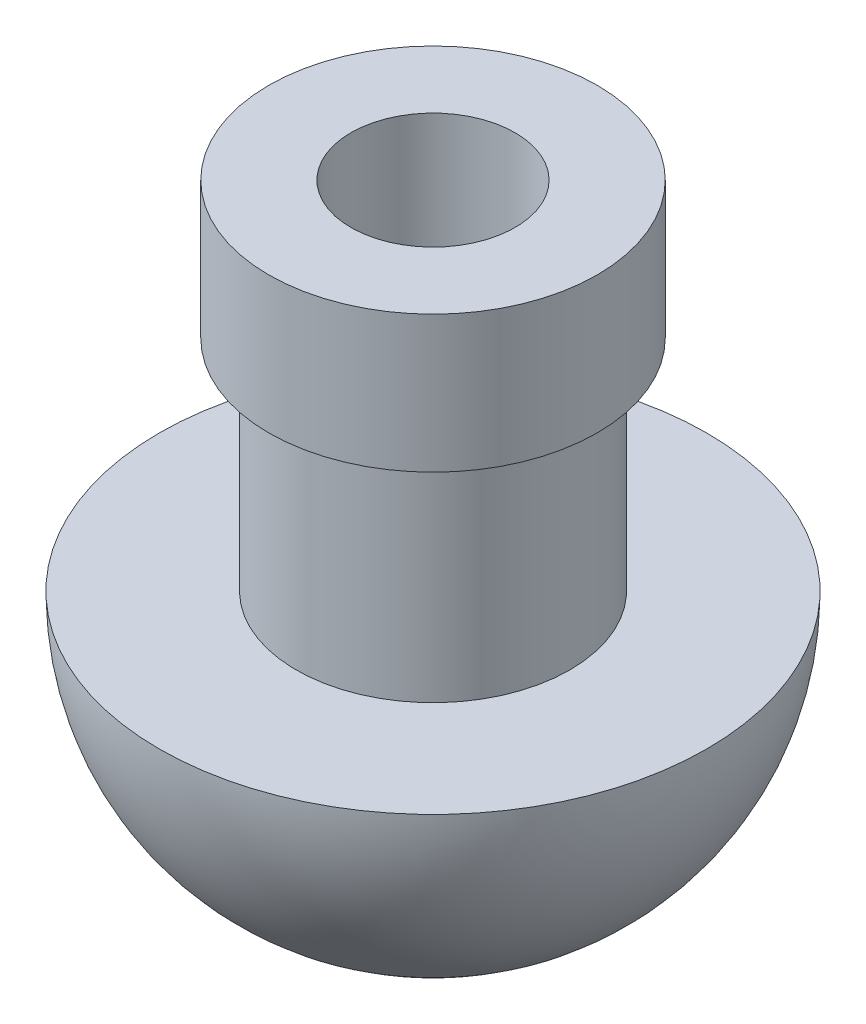
ISO-10303-21;
HEADER;
FILE_DESCRIPTION(('STEP AP214'),'2;1');
FILE_NAME('part.step','',(''),(''),'','','');
FILE_SCHEMA(('AUTOMOTIVE_DESIGN { 1 0 10303 214 1 1 1 1 }'));
ENDSEC;
DATA;
#1=APPLICATION_CONTEXT('core data for automotive mechanical design processes');
#2=APPLICATION_PROTOCOL_DEFINITION('international standard','automotive_design',2000,#1);
#3=PRODUCT_CONTEXT('',#1,'mechanical');
#4=PRODUCT('Part','Part','',(#3));
#5=PRODUCT_RELATED_PRODUCT_CATEGORY('part','',(#4));
#6=PRODUCT_DEFINITION_FORMATION('','',#4);
#7=PRODUCT_DEFINITION_CONTEXT('part definition',#1,'design');
#8=PRODUCT_DEFINITION('design','',#6,#7);
#9=PRODUCT_DEFINITION_SHAPE('','',#8);
#10=(LENGTH_UNIT() NAMED_UNIT(*) SI_UNIT(.MILLI.,.METRE.));
#11=(NAMED_UNIT(*) PLANE_ANGLE_UNIT() SI_UNIT($,.RADIAN.));
#12=(NAMED_UNIT(*) SI_UNIT($,.STERADIAN.) SOLID_ANGLE_UNIT());
#13=UNCERTAINTY_MEASURE_WITH_UNIT(LENGTH_MEASURE(1.E-05),#10,'distance_accuracy_value','');
#14=(GEOMETRIC_REPRESENTATION_CONTEXT(3) GLOBAL_UNCERTAINTY_ASSIGNED_CONTEXT((#13)) GLOBAL_UNIT_ASSIGNED_CONTEXT((#10,
#11,#12)) REPRESENTATION_CONTEXT('',''));
#15=CARTESIAN_POINT('',(0.,0.,0.));
#16=DIRECTION('',(0.,0.,1.));
#17=DIRECTION('',(1.,0.,0.));
#18=AXIS2_PLACEMENT_3D('',#15,#16,#17);
#19=CARTESIAN_POINT('',(-6.,13.,0.));
#20=DIRECTION('',(0.,-1.,0.));
#21=DIRECTION('',(1.,0.,0.));
#22=AXIS2_PLACEMENT_3D('',#19,#20,#21);
#23=PLANE('',#22);
#24=CARTESIAN_POINT('',(0.,13.,0.));
#25=DIRECTION('',(0.,1.,0.));
#26=DIRECTION('',(-1.,0.,0.));
#27=AXIS2_PLACEMENT_3D('',#24,#25,#26);
#28=CIRCLE('',#27,3.);
#29=CARTESIAN_POINT('',(-3.,13.,0.));
#30=VERTEX_POINT('',#29);
#31=EDGE_CURVE('E75',#30,#30,#28,.T.);
#32=ORIENTED_EDGE('',*,*,#31,.F.);
#33=EDGE_LOOP('',(#32));
#34=FACE_BOUND('',#33,.T.);
#35=CARTESIAN_POINT('',(0.,13.,0.));
#36=DIRECTION('',(0.,-1.,0.));
#37=DIRECTION('',(1.,0.,0.));
#38=AXIS2_PLACEMENT_3D('',#35,#36,#37);
#39=CIRCLE('',#38,6.);
#40=CARTESIAN_POINT('',(6.00000000000001,13.,0.));
#41=VERTEX_POINT('',#40);
#42=EDGE_CURVE('E10',#41,#41,#39,.T.);
#43=ORIENTED_EDGE('',*,*,#42,.F.);
#44=EDGE_LOOP('',(#43));
#45=FACE_BOUND('',#44,.T.);
#46=ADVANCED_FACE('F49',(#34,#45),#23,.F.);
#47=CARTESIAN_POINT('',(0.,-10.,0.));
#48=DIRECTION('',(0.,-1.,0.));
#49=DIRECTION('',(1.,0.,0.));
#50=AXIS2_PLACEMENT_3D('',#47,#48,#49);
#51=CYLINDRICAL_SURFACE('',#50,6.);
#52=CARTESIAN_POINT('',(0.,8.,0.));
#53=DIRECTION('',(0.,-1.,0.));
#54=DIRECTION('',(1.,0.,0.));
#55=AXIS2_PLACEMENT_3D('',#52,#53,#54);
#56=CIRCLE('',#55,6.);
#57=CARTESIAN_POINT('',(6.,8.,0.));
#58=VERTEX_POINT('',#57);
#59=EDGE_CURVE('E55',#58,#58,#56,.T.);
#60=ORIENTED_EDGE('',*,*,#59,.F.);
#61=EDGE_LOOP('',(#60));
#62=FACE_BOUND('',#61,.T.);
#63=ORIENTED_EDGE('',*,*,#42,.T.);
#64=EDGE_LOOP('',(#63));
#65=FACE_BOUND('',#64,.T.);
#66=ADVANCED_FACE('F84',(#62,#65),#51,.T.);
#67=CARTESIAN_POINT('',(-6.,8.,0.));
#68=DIRECTION('',(0.,1.,0.));
#69=DIRECTION('',(-1.,0.,0.));
#70=AXIS2_PLACEMENT_3D('',#67,#68,#69);
#71=PLANE('',#70);
#72=CARTESIAN_POINT('',(0.,8.,0.));
#73=DIRECTION('',(0.,-1.,0.));
#74=DIRECTION('',(1.,0.,0.));
#75=AXIS2_PLACEMENT_3D('',#72,#73,#74);
#76=CIRCLE('',#75,5.);
#77=CARTESIAN_POINT('',(5.,8.,0.));
#78=VERTEX_POINT('',#77);
#79=EDGE_CURVE('E59',#78,#78,#76,.T.);
#80=ORIENTED_EDGE('',*,*,#79,.F.);
#81=EDGE_LOOP('',(#80));
#82=FACE_BOUND('',#81,.T.);
#83=ORIENTED_EDGE('',*,*,#59,.T.);
#84=EDGE_LOOP('',(#83));
#85=FACE_BOUND('',#84,.T.);
#86=ADVANCED_FACE('F88',(#82,#85),#71,.F.);
#87=CARTESIAN_POINT('',(0.,-10.,0.));
#88=DIRECTION('',(0.,-1.,0.));
#89=DIRECTION('',(1.,0.,0.));
#90=AXIS2_PLACEMENT_3D('',#87,#88,#89);
#91=CYLINDRICAL_SURFACE('',#90,5.);
#92=CARTESIAN_POINT('',(0.,0.,0.));
#93=DIRECTION('',(0.,-1.,0.));
#94=DIRECTION('',(1.,0.,0.));
#95=AXIS2_PLACEMENT_3D('',#92,#93,#94);
#96=CIRCLE('',#95,5.);
#97=CARTESIAN_POINT('',(5.,0.,0.));
#98=VERTEX_POINT('',#97);
#99=EDGE_CURVE('E63',#98,#98,#96,.T.);
#100=ORIENTED_EDGE('',*,*,#99,.F.);
#101=EDGE_LOOP('',(#100));
#102=FACE_BOUND('',#101,.T.);
#103=ORIENTED_EDGE('',*,*,#79,.T.);
#104=EDGE_LOOP('',(#103));
#105=FACE_BOUND('',#104,.T.);
#106=ADVANCED_FACE('F93',(#102,#105),#91,.T.);
#107=CARTESIAN_POINT('',(-10.,0.,0.));
#108=DIRECTION('',(0.,-1.,0.));
#109=DIRECTION('',(1.,0.,0.));
#110=AXIS2_PLACEMENT_3D('',#107,#108,#109);
#111=PLANE('',#110);
#112=CARTESIAN_POINT('',(0.,0.,0.));
#113=DIRECTION('',(0.,-1.,0.));
#114=DIRECTION('',(1.,0.,0.));
#115=AXIS2_PLACEMENT_3D('',#112,#113,#114);
#116=CIRCLE('',#115,10.);
#117=CARTESIAN_POINT('',(10.,0.,0.));
#118=VERTEX_POINT('',#117);
#119=EDGE_CURVE('E69',#118,#118,#116,.T.);
#120=ORIENTED_EDGE('',*,*,#119,.F.);
#121=EDGE_LOOP('',(#120));
#122=FACE_BOUND('',#121,.T.);
#123=ORIENTED_EDGE('',*,*,#99,.T.);
#124=EDGE_LOOP('',(#123));
#125=FACE_BOUND('',#124,.T.);
#126=ADVANCED_FACE('F99',(#122,#125),#111,.F.);
#127=CARTESIAN_POINT('',(0.,0.,0.));
#128=DIRECTION('',(0.,-1.,0.));
#129=DIRECTION('',(-1.,0.,0.));
#130=AXIS2_PLACEMENT_3D('',#127,#128,#129);
#131=SPHERICAL_SURFACE('',#130,10.);
#132=ORIENTED_EDGE('',*,*,#119,.T.);
#133=EDGE_LOOP('',(#132));
#134=FACE_BOUND('',#133,.T.);
#135=ADVANCED_FACE('F103',(#134),#131,.T.);
#136=CARTESIAN_POINT('',(-10.,0.,0.));
#137=DIRECTION('',(0.,-1.,0.));
#138=DIRECTION('',(1.,0.,0.));
#139=AXIS2_PLACEMENT_3D('',#136,#137,#138);
#140=PLANE('',#139);
#141=CARTESIAN_POINT('',(0.,0.,0.));
#142=DIRECTION('',(0.,-1.,0.));
#143=DIRECTION('',(1.,0.,0.));
#144=AXIS2_PLACEMENT_3D('',#141,#142,#143);
#145=CIRCLE('',#144,3.);
#146=CARTESIAN_POINT('',(3.,0.,0.));
#147=VERTEX_POINT('',#146);
#148=EDGE_CURVE('E72',#147,#147,#145,.F.);
#149=ORIENTED_EDGE('',*,*,#148,.T.);
#150=EDGE_LOOP('',(#149));
#151=FACE_BOUND('',#150,.T.);
#152=ADVANCED_FACE('F107',(#151),#140,.F.);
#153=CARTESIAN_POINT('',(0.,-8.48528137423857,0.));
#154=DIRECTION('',(0.,1.,0.));
#155=DIRECTION('',(-1.,0.,0.));
#156=AXIS2_PLACEMENT_3D('',#153,#154,#155);
#157=CYLINDRICAL_SURFACE('',#156,3.);
#158=ORIENTED_EDGE('',*,*,#31,.T.);
#159=EDGE_LOOP('',(#158));
#160=FACE_BOUND('',#159,.T.);
#161=ORIENTED_EDGE('',*,*,#148,.F.);
#162=EDGE_LOOP('',(#161));
#163=FACE_BOUND('',#162,.T.);
#164=ADVANCED_FACE('F79',(#160,#163),#157,.F.);
#165=CLOSED_SHELL('',(#46,#66,#86,#106,#126,#135,#152,#164));
#166=MANIFOLD_SOLID_BREP('B2',#165);
#167=ADVANCED_BREP_SHAPE_REPRESENTATION('',(#18,#166),#14);
#168=SHAPE_DEFINITION_REPRESENTATION(#9,#167);
ENDSEC;
END-ISO-10303-21;
